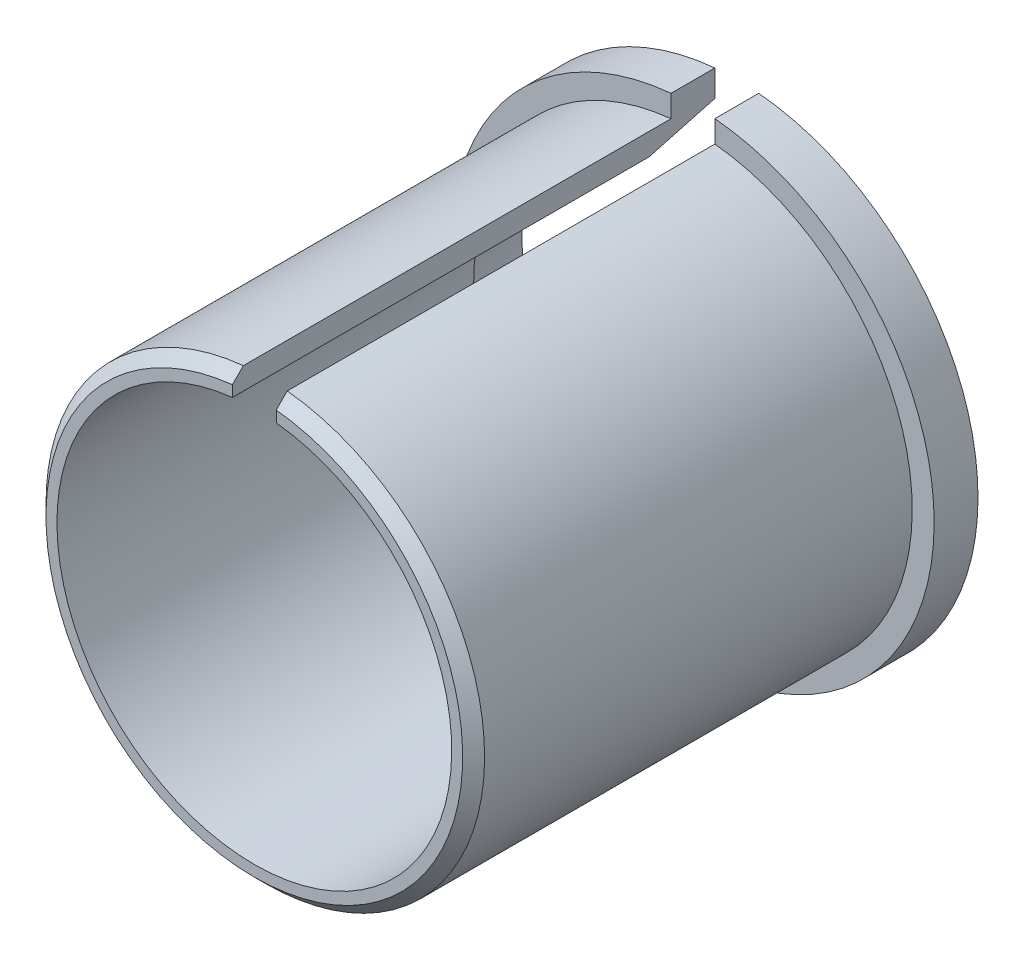
ISO-10303-21;
HEADER;
FILE_DESCRIPTION(('STEP AP214'),'2;1');
FILE_NAME('part.step','',(''),(''),'','','');
FILE_SCHEMA(('AUTOMOTIVE_DESIGN { 1 0 10303 214 1 1 1 1 }'));
ENDSEC;
DATA;
#1=APPLICATION_CONTEXT('core data for automotive mechanical design processes');
#2=APPLICATION_PROTOCOL_DEFINITION('international standard','automotive_design',2000,#1);
#3=PRODUCT_CONTEXT('',#1,'mechanical');
#4=PRODUCT('Part','Part','',(#3));
#5=PRODUCT_RELATED_PRODUCT_CATEGORY('part','',(#4));
#6=PRODUCT_DEFINITION_FORMATION('','',#4);
#7=PRODUCT_DEFINITION_CONTEXT('part definition',#1,'design');
#8=PRODUCT_DEFINITION('design','',#6,#7);
#9=PRODUCT_DEFINITION_SHAPE('','',#8);
#10=(LENGTH_UNIT() NAMED_UNIT(*) SI_UNIT(.MILLI.,.METRE.));
#11=(NAMED_UNIT(*) PLANE_ANGLE_UNIT() SI_UNIT($,.RADIAN.));
#12=(NAMED_UNIT(*) SI_UNIT($,.STERADIAN.) SOLID_ANGLE_UNIT());
#13=UNCERTAINTY_MEASURE_WITH_UNIT(LENGTH_MEASURE(1.E-05),#10,'distance_accuracy_value','');
#14=(GEOMETRIC_REPRESENTATION_CONTEXT(3) GLOBAL_UNCERTAINTY_ASSIGNED_CONTEXT((#13)) GLOBAL_UNIT_ASSIGNED_CONTEXT((#10,
#11,#12)) REPRESENTATION_CONTEXT('',''));
#15=CARTESIAN_POINT('',(0.,0.,0.));
#16=DIRECTION('',(0.,0.,1.));
#17=DIRECTION('',(1.,0.,0.));
#18=AXIS2_PLACEMENT_3D('',#15,#16,#17);
#19=CARTESIAN_POINT('',(0.,11.,-22.));
#20=DIRECTION('',(0.,0.,1.));
#21=DIRECTION('',(1.,0.,0.));
#22=AXIS2_PLACEMENT_3D('',#19,#20,#21);
#23=PLANE('',#22);
#24=DIRECTION('',(0.,-1.,0.));
#25=VECTOR('',#24,1.);
#26=CARTESIAN_POINT('',(-1.,10.9544511501033,-22.));
#27=LINE('',#26,#25);
#28=CARTESIAN_POINT('',(-1.,10.9544511501033,-22.));
#29=VERTEX_POINT('',#28);
#30=CARTESIAN_POINT('',(-1.,9.75271384378733,-22.));
#31=VERTEX_POINT('',#30);
#32=EDGE_CURVE('E120',#29,#31,#27,.T.);
#33=ORIENTED_EDGE('',*,*,#32,.T.);
#34=CARTESIAN_POINT('',(0.,0.,-22.));
#35=DIRECTION('',(0.,0.,-1.));
#36=DIRECTION('',(-1.,0.,0.));
#37=AXIS2_PLACEMENT_3D('',#34,#35,#36);
#38=CIRCLE('',#37,9.80384757729337);
#39=CARTESIAN_POINT('',(0.999999999999998,9.75271384378733,-22.));
#40=VERTEX_POINT('',#39);
#41=EDGE_CURVE('E19',#31,#40,#38,.F.);
#42=ORIENTED_EDGE('',*,*,#41,.T.);
#43=DIRECTION('',(0.,1.,0.));
#44=VECTOR('',#43,1.);
#45=CARTESIAN_POINT('',(0.999999999999997,11.,-22.));
#46=LINE('',#45,#44);
#47=CARTESIAN_POINT('',(0.999999999999998,10.9544511501033,-22.));
#48=VERTEX_POINT('',#47);
#49=EDGE_CURVE('E68',#48,#40,#46,.F.);
#50=ORIENTED_EDGE('',*,*,#49,.F.);
#51=CARTESIAN_POINT('',(0.,0.,-22.));
#52=DIRECTION('',(0.,0.,1.));
#53=DIRECTION('',(1.,0.,0.));
#54=AXIS2_PLACEMENT_3D('',#51,#52,#53);
#55=CIRCLE('',#54,11.);
#56=EDGE_CURVE('E114',#29,#48,#55,.T.);
#57=ORIENTED_EDGE('',*,*,#56,.F.);
#58=EDGE_LOOP('',(#33,#42,#50,#57));
#59=FACE_BOUND('',#58,.T.);
#60=ADVANCED_FACE('F16',(#59),#23,.F.);
#61=CARTESIAN_POINT('',(0.,0.,-22.));
#62=DIRECTION('',(0.,0.,-1.));
#63=DIRECTION('',(-1.,0.,0.));
#64=AXIS2_PLACEMENT_3D('',#61,#62,#63);
#65=CONICAL_SURFACE('',#64,9.80384757729337,0.26179938779915);
#66=CARTESIAN_POINT('',(0.,0.,-19.));
#67=DIRECTION('',(0.,0.,1.));
#68=DIRECTION('',(1.,0.,0.));
#69=AXIS2_PLACEMENT_3D('',#66,#67,#68);
#70=CIRCLE('',#69,9.);
#71=CARTESIAN_POINT('',(-1.,8.94427190999916,-19.));
#72=VERTEX_POINT('',#71);
#73=CARTESIAN_POINT('',(0.999999999999999,8.94427190999916,-19.));
#74=VERTEX_POINT('',#73);
#75=EDGE_CURVE('E127',#72,#74,#70,.T.);
#76=ORIENTED_EDGE('',*,*,#75,.T.);
#77=CARTESIAN_POINT('',(0.999999999999999,8.94427190999916,-19.));
#78=CARTESIAN_POINT('',(0.999999999999999,9.07907379210321,-19.4999834109107));
#79=CARTESIAN_POINT('',(0.999999999999999,9.21384489431516,-19.9999751164065));
#80=CARTESIAN_POINT('',(0.999999999999999,9.4833255389112,-20.9999751164065));
#81=CARTESIAN_POINT('',(0.999999999999999,9.61803508129531,-21.4999834109107));
#82=CARTESIAN_POINT('',(0.999999999999999,9.75271384378733,-22.));
#83=B_SPLINE_CURVE_WITH_KNOTS('',3,(#77,#78,#79,#80,#81,#82),.UNSPECIFIED.,.F.,.F.,(4,2,4),(0.,
1.55351041193954,3.10702082337573),.UNSPECIFIED.);
#84=EDGE_CURVE('E93',#74,#40,#83,.T.);
#85=ORIENTED_EDGE('',*,*,#84,.T.);
#86=ORIENTED_EDGE('',*,*,#41,.F.);
#87=CARTESIAN_POINT('',(-1.,9.75271384378733,-22.));
#88=CARTESIAN_POINT('',(-1.,9.61803508129531,-21.4999834109107));
#89=CARTESIAN_POINT('',(-1.,9.4833255389112,-20.9999751164065));
#90=CARTESIAN_POINT('',(-1.,9.21384489431516,-19.9999751164065));
#91=CARTESIAN_POINT('',(-1.,9.07907379210321,-19.4999834109107));
#92=CARTESIAN_POINT('',(-1.,8.94427190999916,-19.));
#93=B_SPLINE_CURVE_WITH_KNOTS('',3,(#87,#88,#89,#90,#91,#92),.UNSPECIFIED.,.F.,.F.,(4,2,4),(0.,
1.5535104114362,3.10702082337573),.UNSPECIFIED.);
#94=EDGE_CURVE('E122',#31,#72,#93,.T.);
#95=ORIENTED_EDGE('',*,*,#94,.T.);
#96=EDGE_LOOP('',(#76,#85,#86,#95));
#97=FACE_BOUND('',#96,.T.);
#98=ADVANCED_FACE('F175',(#97),#65,.F.);
#99=CARTESIAN_POINT('',(0.,0.,0.));
#100=DIRECTION('',(0.,0.,1.));
#101=DIRECTION('',(1.,0.,0.));
#102=AXIS2_PLACEMENT_3D('',#99,#100,#101);
#103=CYLINDRICAL_SURFACE('',#102,9.);
#104=ORIENTED_EDGE('',*,*,#75,.F.);
#105=DIRECTION('',(0.,0.,1.));
#106=VECTOR('',#105,1.);
#107=CARTESIAN_POINT('',(-1.,8.94427190999916,-22.001));
#108=LINE('',#107,#106);
#109=CARTESIAN_POINT('',(-1.,8.94427190999916,0.));
#110=VERTEX_POINT('',#109);
#111=EDGE_CURVE('E81',#72,#110,#108,.T.);
#112=ORIENTED_EDGE('',*,*,#111,.T.);
#113=CARTESIAN_POINT('',(0.,0.,0.));
#114=DIRECTION('',(0.,0.,1.));
#115=DIRECTION('',(1.,0.,0.));
#116=AXIS2_PLACEMENT_3D('',#113,#114,#115);
#117=CIRCLE('',#116,9.);
#118=CARTESIAN_POINT('',(0.999999999999999,8.94427190999916,0.));
#119=VERTEX_POINT('',#118);
#120=EDGE_CURVE('E75',#110,#119,#117,.T.);
#121=ORIENTED_EDGE('',*,*,#120,.T.);
#122=DIRECTION('',(0.,0.,1.));
#123=VECTOR('',#122,1.);
#124=CARTESIAN_POINT('',(0.999999999999999,8.94427190999916,-22.001));
#125=LINE('',#124,#123);
#126=EDGE_CURVE('E79',#119,#74,#125,.F.);
#127=ORIENTED_EDGE('',*,*,#126,.T.);
#128=EDGE_LOOP('',(#104,#112,#121,#127));
#129=FACE_BOUND('',#128,.T.);
#130=ADVANCED_FACE('F78',(#129),#103,.F.);
#131=CARTESIAN_POINT('',(-1.,10.9544511501033,-22.001));
#132=DIRECTION('',(-1.,0.,0.));
#133=DIRECTION('',(0.,-1.,0.));
#134=AXIS2_PLACEMENT_3D('',#131,#132,#133);
#135=PLANE('',#134);
#136=DIRECTION('',(0.,0.,1.));
#137=VECTOR('',#136,1.);
#138=CARTESIAN_POINT('',(-1.,10.9544511501033,0.));
#139=LINE('',#138,#137);
#140=CARTESIAN_POINT('',(-1.,10.9544511501033,-20.));
#141=VERTEX_POINT('',#140);
#142=EDGE_CURVE('E111',#141,#29,#139,.F.);
#143=ORIENTED_EDGE('',*,*,#142,.F.);
#144=DIRECTION('',(0.,-1.,0.));
#145=VECTOR('',#144,1.);
#146=CARTESIAN_POINT('',(-1.,10.9544511501033,-20.));
#147=LINE('',#146,#145);
#148=CARTESIAN_POINT('',(-1.,9.9498743710662,-20.));
#149=VERTEX_POINT('',#148);
#150=EDGE_CURVE('E117',#149,#141,#147,.F.);
#151=ORIENTED_EDGE('',*,*,#150,.F.);
#152=DIRECTION('',(0.,0.,1.));
#153=VECTOR('',#152,1.);
#154=CARTESIAN_POINT('',(-1.,9.9498743710662,0.));
#155=LINE('',#154,#153);
#156=CARTESIAN_POINT('',(-1.,9.9498743710662,-0.500000000000002));
#157=VERTEX_POINT('',#156);
#158=EDGE_CURVE('E86',#157,#149,#155,.F.);
#159=ORIENTED_EDGE('',*,*,#158,.F.);
#160=CARTESIAN_POINT('',(-1.,9.44722181384559,0.));
#161=CARTESIAN_POINT('',(-1.,9.53100860568328,-0.0833219074230723));
#162=CARTESIAN_POINT('',(-1.,9.61478971470883,-0.166649527806244));
#163=CARTESIAN_POINT('',(-1.,9.7823405671157,-0.333316194472914));
#164=CARTESIAN_POINT('',(-1.,9.86611031049701,-0.416655240756409));
#165=CARTESIAN_POINT('',(-1.,9.9498743710662,-0.500000000000002));
#166=B_SPLINE_CURVE_WITH_KNOTS('',3,(#160,#161,#162,#163,#164,#165),.UNSPECIFIED.,.F.,.F.,(4,2,
4),(0.,0.354492452577574,0.708984905070607),.UNSPECIFIED.);
#167=CARTESIAN_POINT('',(-1.,9.44722181384559,0.));
#168=VERTEX_POINT('',#167);
#169=EDGE_CURVE('E121',#168,#157,#166,.T.);
#170=ORIENTED_EDGE('',*,*,#169,.F.);
#171=DIRECTION('',(0.,1.,0.));
#172=VECTOR('',#171,1.);
#173=CARTESIAN_POINT('',(-1.,9.,0.));
#174=LINE('',#173,#172);
#175=EDGE_CURVE('E87',#168,#110,#174,.F.);
#176=ORIENTED_EDGE('',*,*,#175,.T.);
#177=ORIENTED_EDGE('',*,*,#111,.F.);
#178=ORIENTED_EDGE('',*,*,#94,.F.);
#179=ORIENTED_EDGE('',*,*,#32,.F.);
#180=EDGE_LOOP('',(#143,#151,#159,#170,#176,#177,#178,#179));
#181=FACE_BOUND('',#180,.T.);
#182=ADVANCED_FACE('F167',(#181),#135,.F.);
#183=CARTESIAN_POINT('',(0.,0.,0.));
#184=DIRECTION('',(0.,0.,1.));
#185=DIRECTION('',(1.,0.,0.));
#186=AXIS2_PLACEMENT_3D('',#183,#184,#185);
#187=CYLINDRICAL_SURFACE('',#186,11.);
#188=CARTESIAN_POINT('',(0.,0.,-20.));
#189=DIRECTION('',(0.,0.,1.));
#190=DIRECTION('',(1.,0.,0.));
#191=AXIS2_PLACEMENT_3D('',#188,#189,#190);
#192=CIRCLE('',#191,11.);
#193=CARTESIAN_POINT('',(0.999999999999999,10.9544511501033,-20.));
#194=VERTEX_POINT('',#193);
#195=EDGE_CURVE('E107',#194,#141,#192,.F.);
#196=ORIENTED_EDGE('',*,*,#195,.T.);
#197=ORIENTED_EDGE('',*,*,#142,.T.);
#198=ORIENTED_EDGE('',*,*,#56,.T.);
#199=DIRECTION('',(0.,0.,1.));
#200=VECTOR('',#199,1.);
#201=CARTESIAN_POINT('',(0.999999999999999,10.9544511501033,-22.001));
#202=LINE('',#201,#200);
#203=EDGE_CURVE('E94',#48,#194,#202,.T.);
#204=ORIENTED_EDGE('',*,*,#203,.T.);
#205=EDGE_LOOP('',(#196,#197,#198,#204));
#206=FACE_BOUND('',#205,.T.);
#207=ADVANCED_FACE('F171',(#206),#187,.T.);
#208=CARTESIAN_POINT('',(0.999999999999999,10.9544511501033,-22.001));
#209=DIRECTION('',(1.,0.,0.));
#210=DIRECTION('',(0.,1.,0.));
#211=AXIS2_PLACEMENT_3D('',#208,#209,#210);
#212=PLANE('',#211);
#213=ORIENTED_EDGE('',*,*,#84,.F.);
#214=ORIENTED_EDGE('',*,*,#126,.F.);
#215=DIRECTION('',(0.,1.,0.));
#216=VECTOR('',#215,1.);
#217=CARTESIAN_POINT('',(0.999999999999999,9.,0.));
#218=LINE('',#217,#216);
#219=CARTESIAN_POINT('',(0.999999999999999,9.44722181384559,0.));
#220=VERTEX_POINT('',#219);
#221=EDGE_CURVE('E91',#119,#220,#218,.T.);
#222=ORIENTED_EDGE('',*,*,#221,.T.);
#223=CARTESIAN_POINT('',(0.999999999999999,9.9498743710662,-0.500000000000003));
#224=CARTESIAN_POINT('',(0.999999999999999,9.86611031049701,-0.416655240756409));
#225=CARTESIAN_POINT('',(0.999999999999999,9.7823405671157,-0.333316194472913));
#226=CARTESIAN_POINT('',(0.999999999999999,9.61478971470883,-0.166649527806243));
#227=CARTESIAN_POINT('',(0.999999999999999,9.53100860568328,-0.0833219074230712));
#228=CARTESIAN_POINT('',(0.999999999999999,9.44722181384559,0.));
#229=B_SPLINE_CURVE_WITH_KNOTS('',3,(#223,#224,#225,#226,#227,#228),.UNSPECIFIED.,.F.,.F.,(4,2,
4),(0.,0.354492452493035,0.708984905070609),.UNSPECIFIED.);
#230=CARTESIAN_POINT('',(0.999999999999998,9.9498743710662,-0.500000000000002));
#231=VERTEX_POINT('',#230);
#232=EDGE_CURVE('E98',#231,#220,#229,.T.);
#233=ORIENTED_EDGE('',*,*,#232,.F.);
#234=DIRECTION('',(0.,0.,1.));
#235=VECTOR('',#234,1.);
#236=CARTESIAN_POINT('',(0.999999999999998,9.9498743710662,0.));
#237=LINE('',#236,#235);
#238=CARTESIAN_POINT('',(0.999999999999998,9.9498743710662,-20.));
#239=VERTEX_POINT('',#238);
#240=EDGE_CURVE('E104',#239,#231,#237,.T.);
#241=ORIENTED_EDGE('',*,*,#240,.F.);
#242=DIRECTION('',(0.,1.,0.));
#243=VECTOR('',#242,1.);
#244=CARTESIAN_POINT('',(0.999999999999999,10.,-20.));
#245=LINE('',#244,#243);
#246=EDGE_CURVE('E110',#239,#194,#245,.T.);
#247=ORIENTED_EDGE('',*,*,#246,.T.);
#248=ORIENTED_EDGE('',*,*,#203,.F.);
#249=ORIENTED_EDGE('',*,*,#49,.T.);
#250=EDGE_LOOP('',(#213,#214,#222,#233,#241,#247,#248,#249));
#251=FACE_BOUND('',#250,.T.);
#252=ADVANCED_FACE('F90',(#251),#212,.F.);
#253=CARTESIAN_POINT('',(0.,9.,0.));
#254=DIRECTION('',(0.,0.,-1.));
#255=DIRECTION('',(-1.,0.,0.));
#256=AXIS2_PLACEMENT_3D('',#253,#254,#255);
#257=PLANE('',#256);
#258=ORIENTED_EDGE('',*,*,#175,.F.);
#259=CARTESIAN_POINT('',(0.,0.,0.));
#260=DIRECTION('',(0.,0.,-1.));
#261=DIRECTION('',(-1.,0.,0.));
#262=AXIS2_PLACEMENT_3D('',#259,#260,#261);
#263=CIRCLE('',#262,9.5);
#264=EDGE_CURVE('E97',#220,#168,#263,.T.);
#265=ORIENTED_EDGE('',*,*,#264,.F.);
#266=ORIENTED_EDGE('',*,*,#221,.F.);
#267=ORIENTED_EDGE('',*,*,#120,.F.);
#268=EDGE_LOOP('',(#258,#265,#266,#267));
#269=FACE_BOUND('',#268,.T.);
#270=ADVANCED_FACE('F96',(#269),#257,.F.);
#271=CARTESIAN_POINT('',(0.,10.,-20.));
#272=DIRECTION('',(0.,0.,-1.));
#273=DIRECTION('',(-1.,0.,0.));
#274=AXIS2_PLACEMENT_3D('',#271,#272,#273);
#275=PLANE('',#274);
#276=ORIENTED_EDGE('',*,*,#150,.T.);
#277=ORIENTED_EDGE('',*,*,#195,.F.);
#278=ORIENTED_EDGE('',*,*,#246,.F.);
#279=CARTESIAN_POINT('',(0.,0.,-20.));
#280=DIRECTION('',(0.,0.,1.));
#281=DIRECTION('',(1.,0.,0.));
#282=AXIS2_PLACEMENT_3D('',#279,#280,#281);
#283=CIRCLE('',#282,10.);
#284=EDGE_CURVE('E25',#149,#239,#283,.T.);
#285=ORIENTED_EDGE('',*,*,#284,.F.);
#286=EDGE_LOOP('',(#276,#277,#278,#285));
#287=FACE_BOUND('',#286,.T.);
#288=ADVANCED_FACE('F155',(#287),#275,.F.);
#289=CARTESIAN_POINT('',(0.,0.,-0.500000000000002));
#290=DIRECTION('',(0.,0.,-1.));
#291=DIRECTION('',(-1.,0.,0.));
#292=AXIS2_PLACEMENT_3D('',#289,#290,#291);
#293=CONICAL_SURFACE('',#292,10.,0.785398163397447);
#294=ORIENTED_EDGE('',*,*,#264,.T.);
#295=ORIENTED_EDGE('',*,*,#169,.T.);
#296=CARTESIAN_POINT('',(0.,0.,-0.500000000000002));
#297=DIRECTION('',(0.,0.,1.));
#298=DIRECTION('',(1.,0.,0.));
#299=AXIS2_PLACEMENT_3D('',#296,#297,#298);
#300=CIRCLE('',#299,10.);
#301=EDGE_CURVE('E11',#231,#157,#300,.F.);
#302=ORIENTED_EDGE('',*,*,#301,.F.);
#303=ORIENTED_EDGE('',*,*,#232,.T.);
#304=EDGE_LOOP('',(#294,#295,#302,#303));
#305=FACE_BOUND('',#304,.T.);
#306=ADVANCED_FACE('F149',(#305),#293,.T.);
#307=CARTESIAN_POINT('',(0.,0.,0.));
#308=DIRECTION('',(0.,0.,1.));
#309=DIRECTION('',(1.,0.,0.));
#310=AXIS2_PLACEMENT_3D('',#307,#308,#309);
#311=CYLINDRICAL_SURFACE('',#310,10.);
#312=ORIENTED_EDGE('',*,*,#284,.T.);
#313=ORIENTED_EDGE('',*,*,#240,.T.);
#314=ORIENTED_EDGE('',*,*,#301,.T.);
#315=ORIENTED_EDGE('',*,*,#158,.T.);
#316=EDGE_LOOP('',(#312,#313,#314,#315));
#317=FACE_BOUND('',#316,.T.);
#318=ADVANCED_FACE('F154',(#317),#311,.T.);
#319=CLOSED_SHELL('',(#60,#98,#130,#182,#207,#252,#270,#288,#306,#318));
#320=MANIFOLD_SOLID_BREP('B1',#319);
#321=ADVANCED_BREP_SHAPE_REPRESENTATION('',(#18,#320),#14);
#322=SHAPE_DEFINITION_REPRESENTATION(#9,#321);
ENDSEC;
END-ISO-10303-21;
